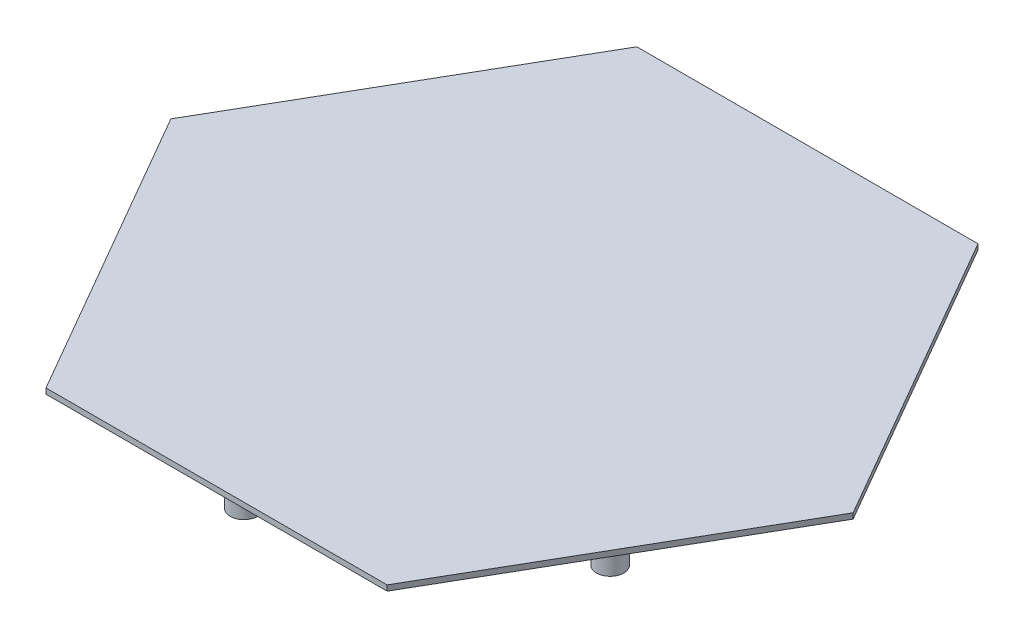
ISO-10303-21;
HEADER;
FILE_DESCRIPTION(('STEP AP214'),'2;1');
FILE_NAME('part.step','',(''),(''),'','','');
FILE_SCHEMA(('AUTOMOTIVE_DESIGN { 1 0 10303 214 1 1 1 1 }'));
ENDSEC;
DATA;
#1=APPLICATION_CONTEXT('core data for automotive mechanical design processes');
#2=APPLICATION_PROTOCOL_DEFINITION('international standard','automotive_design',2000,#1);
#3=PRODUCT_CONTEXT('',#1,'mechanical');
#4=PRODUCT('Part','Part','',(#3));
#5=PRODUCT_RELATED_PRODUCT_CATEGORY('part','',(#4));
#6=PRODUCT_DEFINITION_FORMATION('','',#4);
#7=PRODUCT_DEFINITION_CONTEXT('part definition',#1,'design');
#8=PRODUCT_DEFINITION('design','',#6,#7);
#9=PRODUCT_DEFINITION_SHAPE('','',#8);
#10=(LENGTH_UNIT() NAMED_UNIT(*) SI_UNIT(.MILLI.,.METRE.));
#11=(NAMED_UNIT(*) PLANE_ANGLE_UNIT() SI_UNIT($,.RADIAN.));
#12=(NAMED_UNIT(*) SI_UNIT($,.STERADIAN.) SOLID_ANGLE_UNIT());
#13=UNCERTAINTY_MEASURE_WITH_UNIT(LENGTH_MEASURE(1.E-05),#10,'distance_accuracy_value','');
#14=(GEOMETRIC_REPRESENTATION_CONTEXT(3) GLOBAL_UNCERTAINTY_ASSIGNED_CONTEXT((#13)) GLOBAL_UNIT_ASSIGNED_CONTEXT((#10,
#11,#12)) REPRESENTATION_CONTEXT('',''));
#15=CARTESIAN_POINT('',(0.,0.,0.));
#16=DIRECTION('',(0.,0.,1.));
#17=DIRECTION('',(1.,0.,0.));
#18=AXIS2_PLACEMENT_3D('',#15,#16,#17);
#19=CARTESIAN_POINT('',(0.,15.,0.));
#20=DIRECTION('',(0.,1.,0.));
#21=DIRECTION('',(0.,0.,1.));
#22=AXIS2_PLACEMENT_3D('',#19,#20,#21);
#23=PLANE('',#22);
#24=CARTESIAN_POINT('',(-42.4352447854333,15.,24.5000000000024));
#25=DIRECTION('',(0.,1.,0.));
#26=DIRECTION('',(0.,0.,1.));
#27=AXIS2_PLACEMENT_3D('',#24,#25,#26);
#28=CIRCLE('',#27,2.50000000000516);
#29=CARTESIAN_POINT('',(-42.4352447854333,15.,27.0000000000076));
#30=VERTEX_POINT('',#29);
#31=EDGE_CURVE('E42',#30,#30,#28,.F.);
#32=ORIENTED_EDGE('',*,*,#31,.F.);
#33=EDGE_LOOP('',(#32));
#34=FACE_BOUND('',#33,.T.);
#35=CARTESIAN_POINT('',(42.4352447854417,15.,24.4999999999976));
#36=DIRECTION('',(0.,1.,0.));
#37=DIRECTION('',(0.,0.,1.));
#38=AXIS2_PLACEMENT_3D('',#35,#36,#37);
#39=CIRCLE('',#38,2.50000000000351);
#40=CARTESIAN_POINT('',(42.4352447854417,15.,27.0000000000011));
#41=VERTEX_POINT('',#40);
#42=EDGE_CURVE('E148',#41,#41,#39,.F.);
#43=ORIENTED_EDGE('',*,*,#42,.F.);
#44=EDGE_LOOP('',(#43));
#45=FACE_BOUND('',#44,.T.);
#46=CARTESIAN_POINT('',(0.,15.,-49.));
#47=DIRECTION('',(0.,1.,0.));
#48=DIRECTION('',(0.,0.,1.));
#49=AXIS2_PLACEMENT_3D('',#46,#47,#48);
#50=CIRCLE('',#49,2.5);
#51=CARTESIAN_POINT('',(0.,15.,-46.5));
#52=VERTEX_POINT('',#51);
#53=EDGE_CURVE('E140',#52,#52,#50,.T.);
#54=ORIENTED_EDGE('',*,*,#53,.T.);
#55=EDGE_LOOP('',(#54));
#56=FACE_BOUND('',#55,.T.);
#57=DIRECTION('',(0.5,0.,-0.866025403784439));
#58=VECTOR('',#57,1.);
#59=CARTESIAN_POINT('',(31.1769145362397,15.,53.9999999999999));
#60=LINE('',#59,#58);
#61=CARTESIAN_POINT('',(31.1769145362397,15.,53.9999999999999));
#62=VERTEX_POINT('',#61);
#63=CARTESIAN_POINT('',(62.3538290724794,15.,0.));
#64=VERTEX_POINT('',#63);
#65=EDGE_CURVE('E119',#62,#64,#60,.T.);
#66=ORIENTED_EDGE('',*,*,#65,.F.);
#67=DIRECTION('',(1.,0.,0.));
#68=VECTOR('',#67,1.);
#69=CARTESIAN_POINT('',(-31.1769145362397,15.,53.9999999999999));
#70=LINE('',#69,#68);
#71=CARTESIAN_POINT('',(-31.1769145362397,15.,53.9999999999999));
#72=VERTEX_POINT('',#71);
#73=EDGE_CURVE('E79',#72,#62,#70,.T.);
#74=ORIENTED_EDGE('',*,*,#73,.F.);
#75=DIRECTION('',(0.5,0.,0.866025403784438));
#76=VECTOR('',#75,1.);
#77=CARTESIAN_POINT('',(-62.3538290724794,15.,0.));
#78=LINE('',#77,#76);
#79=CARTESIAN_POINT('',(-62.3538290724794,15.,0.));
#80=VERTEX_POINT('',#79);
#81=EDGE_CURVE('E73',#80,#72,#78,.T.);
#82=ORIENTED_EDGE('',*,*,#81,.F.);
#83=DIRECTION('',(-0.5,0.,0.866025403784439));
#84=VECTOR('',#83,1.);
#85=CARTESIAN_POINT('',(-31.1769145362397,15.,-53.9999999999999));
#86=LINE('',#85,#84);
#87=CARTESIAN_POINT('',(-31.1769145362397,15.,-53.9999999999999));
#88=VERTEX_POINT('',#87);
#89=EDGE_CURVE('E109',#88,#80,#86,.T.);
#90=ORIENTED_EDGE('',*,*,#89,.F.);
#91=DIRECTION('',(-1.,0.,0.));
#92=VECTOR('',#91,1.);
#93=CARTESIAN_POINT('',(31.1769145362397,15.,-53.9999999999999));
#94=LINE('',#93,#92);
#95=CARTESIAN_POINT('',(31.1769145362397,15.,-53.9999999999999));
#96=VERTEX_POINT('',#95);
#97=EDGE_CURVE('E125',#96,#88,#94,.T.);
#98=ORIENTED_EDGE('',*,*,#97,.F.);
#99=DIRECTION('',(-0.5,0.,-0.866025403784439));
#100=VECTOR('',#99,1.);
#101=CARTESIAN_POINT('',(62.3538290724794,15.,0.));
#102=LINE('',#101,#100);
#103=EDGE_CURVE('E122',#64,#96,#102,.T.);
#104=ORIENTED_EDGE('',*,*,#103,.F.);
#105=EDGE_LOOP('',(#66,#74,#82,#90,#98,#104));
#106=FACE_BOUND('',#105,.T.);
#107=CARTESIAN_POINT('',(42.4352447854389,15.,-24.5000000000024));
#108=DIRECTION('',(0.,1.,0.));
#109=DIRECTION('',(0.,0.,1.));
#110=AXIS2_PLACEMENT_3D('',#107,#108,#109);
#111=CIRCLE('',#110,2.50000000000076);
#112=CARTESIAN_POINT('',(42.4352447854389,15.,-22.0000000000017));
#113=VERTEX_POINT('',#112);
#114=EDGE_CURVE('E143',#113,#113,#111,.F.);
#115=ORIENTED_EDGE('',*,*,#114,.F.);
#116=EDGE_LOOP('',(#115));
#117=FACE_BOUND('',#116,.T.);
#118=CARTESIAN_POINT('',(5.55865350972754E-12,15.,49.));
#119=DIRECTION('',(0.,1.,0.));
#120=DIRECTION('',(0.,0.,1.));
#121=AXIS2_PLACEMENT_3D('',#118,#119,#120);
#122=CIRCLE('',#121,2.50000000000565);
#123=CARTESIAN_POINT('',(5.55865350972754E-12,15.,51.5000000000057));
#124=VERTEX_POINT('',#123);
#125=EDGE_CURVE('E151',#124,#124,#122,.F.);
#126=ORIENTED_EDGE('',*,*,#125,.F.);
#127=EDGE_LOOP('',(#126));
#128=FACE_BOUND('',#127,.T.);
#129=CARTESIAN_POINT('',(-42.4352447854361,15.,-24.4999999999976));
#130=DIRECTION('',(0.,1.,0.));
#131=DIRECTION('',(0.,0.,1.));
#132=AXIS2_PLACEMENT_3D('',#129,#130,#131);
#133=CIRCLE('',#132,2.50000000000262);
#134=CARTESIAN_POINT('',(-42.4352447854361,15.,-21.999999999995));
#135=VERTEX_POINT('',#134);
#136=EDGE_CURVE('E11',#135,#135,#133,.F.);
#137=ORIENTED_EDGE('',*,*,#136,.F.);
#138=EDGE_LOOP('',(#137));
#139=FACE_BOUND('',#138,.T.);
#140=ADVANCED_FACE('F33',(#34,#45,#56,#106,#117,#128,#139),#23,.F.);
#141=CARTESIAN_POINT('',(0.,15.,-49.));
#142=DIRECTION('',(0.,-1.,0.));
#143=DIRECTION('',(0.,0.,-1.));
#144=AXIS2_PLACEMENT_3D('',#141,#142,#143);
#145=CYLINDRICAL_SURFACE('',#144,2.5);
#146=ORIENTED_EDGE('',*,*,#53,.F.);
#147=EDGE_LOOP('',(#146));
#148=FACE_BOUND('',#147,.T.);
#149=CARTESIAN_POINT('',(0.,10.,-49.));
#150=DIRECTION('',(0.,1.,0.));
#151=DIRECTION('',(0.,0.,1.));
#152=AXIS2_PLACEMENT_3D('',#149,#150,#151);
#153=CIRCLE('',#152,2.5);
#154=CARTESIAN_POINT('',(0.,10.,-46.5));
#155=VERTEX_POINT('',#154);
#156=EDGE_CURVE('E139',#155,#155,#153,.T.);
#157=ORIENTED_EDGE('',*,*,#156,.T.);
#158=EDGE_LOOP('',(#157));
#159=FACE_BOUND('',#158,.T.);
#160=ADVANCED_FACE('F35',(#148,#159),#145,.T.);
#161=CARTESIAN_POINT('',(0.,10.,-49.));
#162=DIRECTION('',(0.,1.,0.));
#163=DIRECTION('',(0.,0.,1.));
#164=AXIS2_PLACEMENT_3D('',#161,#162,#163);
#165=PLANE('',#164);
#166=ORIENTED_EDGE('',*,*,#156,.F.);
#167=EDGE_LOOP('',(#166));
#168=FACE_BOUND('',#167,.T.);
#169=ADVANCED_FACE('F224',(#168),#165,.F.);
#170=CARTESIAN_POINT('',(31.1769145362397,16.,53.9999999999999));
#171=DIRECTION('',(-0.866025403784439,0.,-0.5));
#172=DIRECTION('',(-0.5,0.,0.866025403784439));
#173=AXIS2_PLACEMENT_3D('',#170,#171,#172);
#174=PLANE('',#173);
#175=ORIENTED_EDGE('',*,*,#65,.T.);
#176=DIRECTION('',(0.,-1.,0.));
#177=VECTOR('',#176,1.);
#178=CARTESIAN_POINT('',(62.3538290724794,16.,0.));
#179=LINE('',#178,#177);
#180=CARTESIAN_POINT('',(62.3538290724794,16.,0.));
#181=VERTEX_POINT('',#180);
#182=EDGE_CURVE('E137',#181,#64,#179,.T.);
#183=ORIENTED_EDGE('',*,*,#182,.F.);
#184=DIRECTION('',(0.5,0.,-0.866025403784439));
#185=VECTOR('',#184,1.);
#186=CARTESIAN_POINT('',(31.1769145362397,16.,53.9999999999999));
#187=LINE('',#186,#185);
#188=CARTESIAN_POINT('',(31.1769145362397,16.,53.9999999999999));
#189=VERTEX_POINT('',#188);
#190=EDGE_CURVE('E130',#189,#181,#187,.T.);
#191=ORIENTED_EDGE('',*,*,#190,.F.);
#192=DIRECTION('',(0.,-1.,0.));
#193=VECTOR('',#192,1.);
#194=CARTESIAN_POINT('',(31.1769145362397,16.,53.9999999999999));
#195=LINE('',#194,#193);
#196=EDGE_CURVE('E115',#189,#62,#195,.T.);
#197=ORIENTED_EDGE('',*,*,#196,.T.);
#198=EDGE_LOOP('',(#175,#183,#191,#197));
#199=FACE_BOUND('',#198,.T.);
#200=ADVANCED_FACE('F205',(#199),#174,.F.);
#201=CARTESIAN_POINT('',(62.3538290724794,16.,0.));
#202=DIRECTION('',(-0.866025403784439,0.,0.5));
#203=DIRECTION('',(0.5,0.,0.866025403784439));
#204=AXIS2_PLACEMENT_3D('',#201,#202,#203);
#205=PLANE('',#204);
#206=ORIENTED_EDGE('',*,*,#103,.T.);
#207=DIRECTION('',(0.,-1.,0.));
#208=VECTOR('',#207,1.);
#209=CARTESIAN_POINT('',(31.1769145362397,16.,-53.9999999999999));
#210=LINE('',#209,#208);
#211=CARTESIAN_POINT('',(31.1769145362397,16.,-53.9999999999999));
#212=VERTEX_POINT('',#211);
#213=EDGE_CURVE('E134',#212,#96,#210,.T.);
#214=ORIENTED_EDGE('',*,*,#213,.F.);
#215=DIRECTION('',(-0.5,0.,-0.866025403784439));
#216=VECTOR('',#215,1.);
#217=CARTESIAN_POINT('',(62.3538290724794,16.,0.));
#218=LINE('',#217,#216);
#219=EDGE_CURVE('E88',#181,#212,#218,.T.);
#220=ORIENTED_EDGE('',*,*,#219,.F.);
#221=ORIENTED_EDGE('',*,*,#182,.T.);
#222=EDGE_LOOP('',(#206,#214,#220,#221));
#223=FACE_BOUND('',#222,.T.);
#224=ADVANCED_FACE('F200',(#223),#205,.F.);
#225=CARTESIAN_POINT('',(31.1769145362397,16.,-53.9999999999999));
#226=DIRECTION('',(0.,0.,1.));
#227=DIRECTION('',(1.,0.,0.));
#228=AXIS2_PLACEMENT_3D('',#225,#226,#227);
#229=PLANE('',#228);
#230=ORIENTED_EDGE('',*,*,#97,.T.);
#231=DIRECTION('',(0.,-1.,0.));
#232=VECTOR('',#231,1.);
#233=CARTESIAN_POINT('',(-31.1769145362397,16.,-53.9999999999999));
#234=LINE('',#233,#232);
#235=CARTESIAN_POINT('',(-31.1769145362397,16.,-53.9999999999999));
#236=VERTEX_POINT('',#235);
#237=EDGE_CURVE('E110',#236,#88,#234,.T.);
#238=ORIENTED_EDGE('',*,*,#237,.F.);
#239=DIRECTION('',(-1.,0.,0.));
#240=VECTOR('',#239,1.);
#241=CARTESIAN_POINT('',(31.1769145362397,16.,-53.9999999999999));
#242=LINE('',#241,#240);
#243=EDGE_CURVE('E101',#212,#236,#242,.T.);
#244=ORIENTED_EDGE('',*,*,#243,.F.);
#245=ORIENTED_EDGE('',*,*,#213,.T.);
#246=EDGE_LOOP('',(#230,#238,#244,#245));
#247=FACE_BOUND('',#246,.T.);
#248=ADVANCED_FACE('F203',(#247),#229,.F.);
#249=CARTESIAN_POINT('',(-31.1769145362397,16.,-53.9999999999999));
#250=DIRECTION('',(0.866025403784439,0.,0.5));
#251=DIRECTION('',(0.5,0.,-0.866025403784439));
#252=AXIS2_PLACEMENT_3D('',#249,#250,#251);
#253=PLANE('',#252);
#254=ORIENTED_EDGE('',*,*,#89,.T.);
#255=DIRECTION('',(0.,-1.,0.));
#256=VECTOR('',#255,1.);
#257=CARTESIAN_POINT('',(-62.3538290724794,16.,0.));
#258=LINE('',#257,#256);
#259=CARTESIAN_POINT('',(-62.3538290724794,16.,0.));
#260=VERTEX_POINT('',#259);
#261=EDGE_CURVE('E106',#260,#80,#258,.T.);
#262=ORIENTED_EDGE('',*,*,#261,.F.);
#263=DIRECTION('',(-0.5,0.,0.866025403784439));
#264=VECTOR('',#263,1.);
#265=CARTESIAN_POINT('',(-31.1769145362397,16.,-53.9999999999999));
#266=LINE('',#265,#264);
#267=EDGE_CURVE('E95',#236,#260,#266,.T.);
#268=ORIENTED_EDGE('',*,*,#267,.F.);
#269=ORIENTED_EDGE('',*,*,#237,.T.);
#270=EDGE_LOOP('',(#254,#262,#268,#269));
#271=FACE_BOUND('',#270,.T.);
#272=ADVANCED_FACE('F107',(#271),#253,.F.);
#273=CARTESIAN_POINT('',(-62.3538290724794,16.,0.));
#274=DIRECTION('',(0.866025403784439,0.,-0.5));
#275=DIRECTION('',(-0.5,0.,-0.866025403784439));
#276=AXIS2_PLACEMENT_3D('',#273,#274,#275);
#277=PLANE('',#276);
#278=ORIENTED_EDGE('',*,*,#81,.T.);
#279=DIRECTION('',(0.,-1.,0.));
#280=VECTOR('',#279,1.);
#281=CARTESIAN_POINT('',(-31.1769145362397,16.,53.9999999999999));
#282=LINE('',#281,#280);
#283=CARTESIAN_POINT('',(-31.1769145362397,16.,53.9999999999999));
#284=VERTEX_POINT('',#283);
#285=EDGE_CURVE('E111',#284,#72,#282,.T.);
#286=ORIENTED_EDGE('',*,*,#285,.F.);
#287=DIRECTION('',(0.5,0.,0.866025403784438));
#288=VECTOR('',#287,1.);
#289=CARTESIAN_POINT('',(-62.3538290724794,16.,0.));
#290=LINE('',#289,#288);
#291=EDGE_CURVE('E99',#260,#284,#290,.T.);
#292=ORIENTED_EDGE('',*,*,#291,.F.);
#293=ORIENTED_EDGE('',*,*,#261,.T.);
#294=EDGE_LOOP('',(#278,#286,#292,#293));
#295=FACE_BOUND('',#294,.T.);
#296=ADVANCED_FACE('F113',(#295),#277,.F.);
#297=CARTESIAN_POINT('',(-31.1769145362397,16.,53.9999999999999));
#298=DIRECTION('',(0.,0.,-1.));
#299=DIRECTION('',(-1.,0.,0.));
#300=AXIS2_PLACEMENT_3D('',#297,#298,#299);
#301=PLANE('',#300);
#302=ORIENTED_EDGE('',*,*,#73,.T.);
#303=ORIENTED_EDGE('',*,*,#196,.F.);
#304=DIRECTION('',(1.,0.,0.));
#305=VECTOR('',#304,1.);
#306=CARTESIAN_POINT('',(-31.1769145362397,16.,53.9999999999999));
#307=LINE('',#306,#305);
#308=EDGE_CURVE('E50',#284,#189,#307,.T.);
#309=ORIENTED_EDGE('',*,*,#308,.F.);
#310=ORIENTED_EDGE('',*,*,#285,.T.);
#311=EDGE_LOOP('',(#302,#303,#309,#310));
#312=FACE_BOUND('',#311,.T.);
#313=ADVANCED_FACE('F206',(#312),#301,.F.);
#314=CARTESIAN_POINT('',(0.,16.,0.));
#315=DIRECTION('',(0.,1.,0.));
#316=DIRECTION('',(0.,0.,1.));
#317=AXIS2_PLACEMENT_3D('',#314,#315,#316);
#318=PLANE('',#317);
#319=ORIENTED_EDGE('',*,*,#190,.T.);
#320=ORIENTED_EDGE('',*,*,#219,.T.);
#321=ORIENTED_EDGE('',*,*,#243,.T.);
#322=ORIENTED_EDGE('',*,*,#267,.T.);
#323=ORIENTED_EDGE('',*,*,#291,.T.);
#324=ORIENTED_EDGE('',*,*,#308,.T.);
#325=EDGE_LOOP('',(#319,#320,#321,#322,#323,#324));
#326=FACE_BOUND('',#325,.T.);
#327=ADVANCED_FACE('F97',(#326),#318,.T.);
#328=CARTESIAN_POINT('',(42.4352447854389,15.,-24.5000000000024));
#329=DIRECTION('',(0.,-1.,0.));
#330=DIRECTION('',(0.,0.,-1.));
#331=AXIS2_PLACEMENT_3D('',#328,#329,#330);
#332=CYLINDRICAL_SURFACE('',#331,2.50000000000076);
#333=ORIENTED_EDGE('',*,*,#114,.T.);
#334=EDGE_LOOP('',(#333));
#335=FACE_BOUND('',#334,.T.);
#336=CARTESIAN_POINT('',(42.4352447854389,10.,-24.5000000000024));
#337=DIRECTION('',(0.,1.,0.));
#338=DIRECTION('',(0.,0.,1.));
#339=AXIS2_PLACEMENT_3D('',#336,#337,#338);
#340=CIRCLE('',#339,2.50000000000076);
#341=CARTESIAN_POINT('',(42.4352447854389,10.,-22.0000000000017));
#342=VERTEX_POINT('',#341);
#343=EDGE_CURVE('E123',#342,#342,#340,.T.);
#344=ORIENTED_EDGE('',*,*,#343,.T.);
#345=EDGE_LOOP('',(#344));
#346=FACE_BOUND('',#345,.T.);
#347=ADVANCED_FACE('F213',(#335,#346),#332,.T.);
#348=CARTESIAN_POINT('',(42.4352447854389,10.,-24.5000000000024));
#349=DIRECTION('',(0.,1.,0.));
#350=DIRECTION('',(0.,0.,1.));
#351=AXIS2_PLACEMENT_3D('',#348,#349,#350);
#352=PLANE('',#351);
#353=ORIENTED_EDGE('',*,*,#343,.F.);
#354=EDGE_LOOP('',(#353));
#355=FACE_BOUND('',#354,.T.);
#356=ADVANCED_FACE('F291',(#355),#352,.F.);
#357=CARTESIAN_POINT('',(42.4352447854417,15.,24.4999999999976));
#358=DIRECTION('',(0.,-1.,0.));
#359=DIRECTION('',(0.,0.,-1.));
#360=AXIS2_PLACEMENT_3D('',#357,#358,#359);
#361=CYLINDRICAL_SURFACE('',#360,2.50000000000351);
#362=ORIENTED_EDGE('',*,*,#42,.T.);
#363=EDGE_LOOP('',(#362));
#364=FACE_BOUND('',#363,.T.);
#365=CARTESIAN_POINT('',(42.4352447854417,10.,24.4999999999976));
#366=DIRECTION('',(0.,1.,0.));
#367=DIRECTION('',(0.,0.,1.));
#368=AXIS2_PLACEMENT_3D('',#365,#366,#367);
#369=CIRCLE('',#368,2.50000000000351);
#370=CARTESIAN_POINT('',(42.4352447854417,10.,27.0000000000011));
#371=VERTEX_POINT('',#370);
#372=EDGE_CURVE('E192',#371,#371,#369,.T.);
#373=ORIENTED_EDGE('',*,*,#372,.T.);
#374=EDGE_LOOP('',(#373));
#375=FACE_BOUND('',#374,.T.);
#376=ADVANCED_FACE('F301',(#364,#375),#361,.T.);
#377=CARTESIAN_POINT('',(42.4352447854417,10.,24.4999999999976));
#378=DIRECTION('',(0.,1.,0.));
#379=DIRECTION('',(0.,0.,1.));
#380=AXIS2_PLACEMENT_3D('',#377,#378,#379);
#381=PLANE('',#380);
#382=ORIENTED_EDGE('',*,*,#372,.F.);
#383=EDGE_LOOP('',(#382));
#384=FACE_BOUND('',#383,.T.);
#385=ADVANCED_FACE('F311',(#384),#381,.F.);
#386=CARTESIAN_POINT('',(5.55865350972754E-12,15.,49.));
#387=DIRECTION('',(0.,-1.,0.));
#388=DIRECTION('',(0.,0.,-1.));
#389=AXIS2_PLACEMENT_3D('',#386,#387,#388);
#390=CYLINDRICAL_SURFACE('',#389,2.50000000000565);
#391=ORIENTED_EDGE('',*,*,#125,.T.);
#392=EDGE_LOOP('',(#391));
#393=FACE_BOUND('',#392,.T.);
#394=CARTESIAN_POINT('',(5.55865350972754E-12,10.,49.));
#395=DIRECTION('',(0.,1.,0.));
#396=DIRECTION('',(0.,0.,1.));
#397=AXIS2_PLACEMENT_3D('',#394,#395,#396);
#398=CIRCLE('',#397,2.50000000000565);
#399=CARTESIAN_POINT('',(5.55865350972754E-12,10.,51.5000000000057));
#400=VERTEX_POINT('',#399);
#401=EDGE_CURVE('E187',#400,#400,#398,.T.);
#402=ORIENTED_EDGE('',*,*,#401,.T.);
#403=EDGE_LOOP('',(#402));
#404=FACE_BOUND('',#403,.T.);
#405=ADVANCED_FACE('F321',(#393,#404),#390,.T.);
#406=CARTESIAN_POINT('',(5.55865350972754E-12,10.,49.));
#407=DIRECTION('',(0.,1.,0.));
#408=DIRECTION('',(0.,0.,1.));
#409=AXIS2_PLACEMENT_3D('',#406,#407,#408);
#410=PLANE('',#409);
#411=ORIENTED_EDGE('',*,*,#401,.F.);
#412=EDGE_LOOP('',(#411));
#413=FACE_BOUND('',#412,.T.);
#414=ADVANCED_FACE('F331',(#413),#410,.F.);
#415=CARTESIAN_POINT('',(-42.4352447854333,15.,24.5000000000024));
#416=DIRECTION('',(0.,-1.,0.));
#417=DIRECTION('',(0.,0.,-1.));
#418=AXIS2_PLACEMENT_3D('',#415,#416,#417);
#419=CYLINDRICAL_SURFACE('',#418,2.50000000000516);
#420=ORIENTED_EDGE('',*,*,#31,.T.);
#421=EDGE_LOOP('',(#420));
#422=FACE_BOUND('',#421,.T.);
#423=CARTESIAN_POINT('',(-42.4352447854333,10.,24.5000000000024));
#424=DIRECTION('',(0.,1.,0.));
#425=DIRECTION('',(0.,0.,1.));
#426=AXIS2_PLACEMENT_3D('',#423,#424,#425);
#427=CIRCLE('',#426,2.50000000000516);
#428=CARTESIAN_POINT('',(-42.4352447854333,10.,27.0000000000076));
#429=VERTEX_POINT('',#428);
#430=EDGE_CURVE('E184',#429,#429,#427,.T.);
#431=ORIENTED_EDGE('',*,*,#430,.T.);
#432=EDGE_LOOP('',(#431));
#433=FACE_BOUND('',#432,.T.);
#434=ADVANCED_FACE('F156',(#422,#433),#419,.T.);
#435=CARTESIAN_POINT('',(-42.4352447854333,10.,24.5000000000024));
#436=DIRECTION('',(0.,1.,0.));
#437=DIRECTION('',(0.,0.,1.));
#438=AXIS2_PLACEMENT_3D('',#435,#436,#437);
#439=PLANE('',#438);
#440=ORIENTED_EDGE('',*,*,#430,.F.);
#441=EDGE_LOOP('',(#440));
#442=FACE_BOUND('',#441,.T.);
#443=ADVANCED_FACE('F178',(#442),#439,.F.);
#444=CARTESIAN_POINT('',(-42.4352447854361,15.,-24.4999999999976));
#445=DIRECTION('',(0.,-1.,0.));
#446=DIRECTION('',(0.,0.,-1.));
#447=AXIS2_PLACEMENT_3D('',#444,#445,#446);
#448=CYLINDRICAL_SURFACE('',#447,2.50000000000262);
#449=ORIENTED_EDGE('',*,*,#136,.T.);
#450=EDGE_LOOP('',(#449));
#451=FACE_BOUND('',#450,.T.);
#452=CARTESIAN_POINT('',(-42.4352447854361,10.,-24.4999999999976));
#453=DIRECTION('',(0.,1.,0.));
#454=DIRECTION('',(0.,0.,1.));
#455=AXIS2_PLACEMENT_3D('',#452,#453,#454);
#456=CIRCLE('',#455,2.50000000000262);
#457=CARTESIAN_POINT('',(-42.4352447854361,10.,-21.999999999995));
#458=VERTEX_POINT('',#457);
#459=EDGE_CURVE('E182',#458,#458,#456,.T.);
#460=ORIENTED_EDGE('',*,*,#459,.T.);
#461=EDGE_LOOP('',(#460));
#462=FACE_BOUND('',#461,.T.);
#463=ADVANCED_FACE('F174',(#451,#462),#448,.T.);
#464=CARTESIAN_POINT('',(-42.4352447854361,10.,-24.4999999999976));
#465=DIRECTION('',(0.,1.,0.));
#466=DIRECTION('',(0.,0.,1.));
#467=AXIS2_PLACEMENT_3D('',#464,#465,#466);
#468=PLANE('',#467);
#469=ORIENTED_EDGE('',*,*,#459,.F.);
#470=EDGE_LOOP('',(#469));
#471=FACE_BOUND('',#470,.T.);
#472=ADVANCED_FACE('F177',(#471),#468,.F.);
#473=CLOSED_SHELL('',(#140,#160,#169,#200,#224,#248,#272,#296,#313,#327,#347,#356,#376,#385,
#405,#414,#434,#443,#463,#472));
#474=MANIFOLD_SOLID_BREP('B2',#473);
#475=ADVANCED_BREP_SHAPE_REPRESENTATION('',(#18,#474),#14);
#476=SHAPE_DEFINITION_REPRESENTATION(#9,#475);
ENDSEC;
END-ISO-10303-21;
